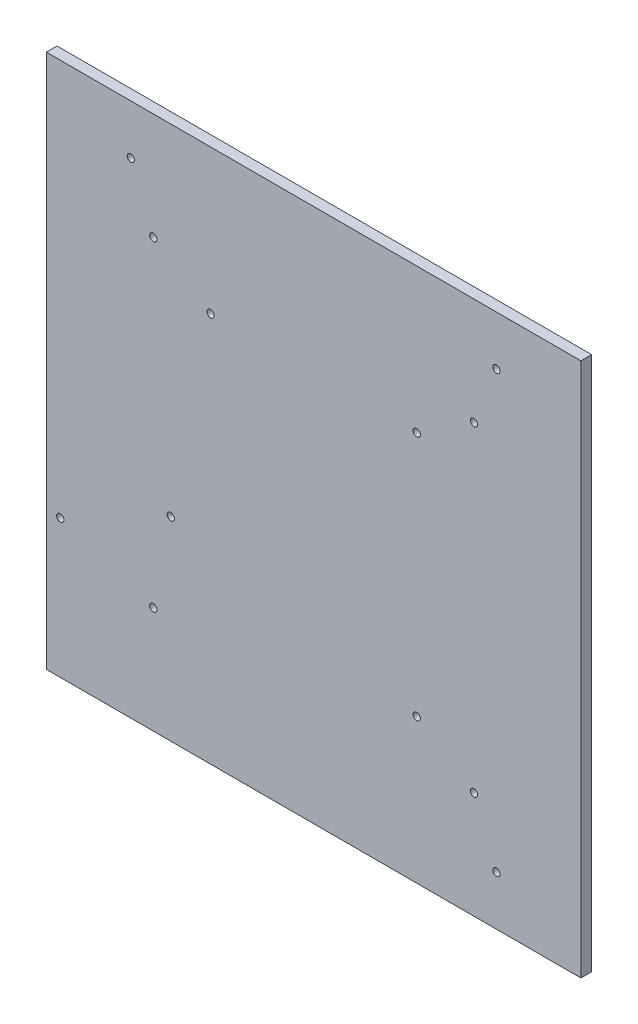
ISO-10303-21;
HEADER;
FILE_DESCRIPTION(('STEP AP214'),'2;1');
FILE_NAME('part.step','',(''),(''),'','','');
FILE_SCHEMA(('AUTOMOTIVE_DESIGN { 1 0 10303 214 1 1 1 1 }'));
ENDSEC;
DATA;
#1=APPLICATION_CONTEXT('core data for automotive mechanical design processes');
#2=APPLICATION_PROTOCOL_DEFINITION('international standard','automotive_design',2000,#1);
#3=PRODUCT_CONTEXT('',#1,'mechanical');
#4=PRODUCT('Part','Part','',(#3));
#5=PRODUCT_RELATED_PRODUCT_CATEGORY('part','',(#4));
#6=PRODUCT_DEFINITION_FORMATION('','',#4);
#7=PRODUCT_DEFINITION_CONTEXT('part definition',#1,'design');
#8=PRODUCT_DEFINITION('design','',#6,#7);
#9=PRODUCT_DEFINITION_SHAPE('','',#8);
#10=(LENGTH_UNIT() NAMED_UNIT(*) SI_UNIT(.MILLI.,.METRE.));
#11=(NAMED_UNIT(*) PLANE_ANGLE_UNIT() SI_UNIT($,.RADIAN.));
#12=(NAMED_UNIT(*) SI_UNIT($,.STERADIAN.) SOLID_ANGLE_UNIT());
#13=UNCERTAINTY_MEASURE_WITH_UNIT(LENGTH_MEASURE(1.E-05),#10,'distance_accuracy_value','');
#14=(GEOMETRIC_REPRESENTATION_CONTEXT(3) GLOBAL_UNCERTAINTY_ASSIGNED_CONTEXT((#13)) GLOBAL_UNIT_ASSIGNED_CONTEXT((#10,
#11,#12)) REPRESENTATION_CONTEXT('',''));
#15=CARTESIAN_POINT('',(0.,0.,0.));
#16=DIRECTION('',(0.,0.,1.));
#17=DIRECTION('',(1.,0.,0.));
#18=AXIS2_PLACEMENT_3D('',#15,#16,#17);
#19=CARTESIAN_POINT('',(250.,-250.,10.));
#20=DIRECTION('',(-1.,0.,0.));
#21=DIRECTION('',(0.,0.,1.));
#22=AXIS2_PLACEMENT_3D('',#19,#20,#21);
#23=PLANE('',#22);
#24=DIRECTION('',(0.,1.,0.));
#25=VECTOR('',#24,1.);
#26=CARTESIAN_POINT('',(250.,-250.,0.));
#27=LINE('',#26,#25);
#28=CARTESIAN_POINT('',(250.,-250.,0.));
#29=VERTEX_POINT('',#28);
#30=CARTESIAN_POINT('',(250.,250.,0.));
#31=VERTEX_POINT('',#30);
#32=EDGE_CURVE('E97',#29,#31,#27,.T.);
#33=ORIENTED_EDGE('',*,*,#32,.T.);
#34=DIRECTION('',(0.,0.,-1.));
#35=VECTOR('',#34,1.);
#36=CARTESIAN_POINT('',(250.,250.,10.));
#37=LINE('',#36,#35);
#38=CARTESIAN_POINT('',(250.,250.,10.));
#39=VERTEX_POINT('',#38);
#40=EDGE_CURVE('E11',#39,#31,#37,.T.);
#41=ORIENTED_EDGE('',*,*,#40,.F.);
#42=DIRECTION('',(0.,1.,0.));
#43=VECTOR('',#42,1.);
#44=CARTESIAN_POINT('',(250.,-250.,10.));
#45=LINE('',#44,#43);
#46=CARTESIAN_POINT('',(250.,-250.,10.));
#47=VERTEX_POINT('',#46);
#48=EDGE_CURVE('E85',#47,#39,#45,.T.);
#49=ORIENTED_EDGE('',*,*,#48,.F.);
#50=DIRECTION('',(0.,0.,-1.));
#51=VECTOR('',#50,1.);
#52=CARTESIAN_POINT('',(250.,-250.,10.));
#53=LINE('',#52,#51);
#54=EDGE_CURVE('E93',#47,#29,#53,.T.);
#55=ORIENTED_EDGE('',*,*,#54,.T.);
#56=EDGE_LOOP('',(#33,#41,#49,#55));
#57=FACE_BOUND('',#56,.T.);
#58=ADVANCED_FACE('F34',(#57),#23,.F.);
#59=CARTESIAN_POINT('',(-250.,250.,10.));
#60=DIRECTION('',(0.,-1.,0.));
#61=DIRECTION('',(0.,0.,-1.));
#62=AXIS2_PLACEMENT_3D('',#59,#60,#61);
#63=PLANE('',#62);
#64=DIRECTION('',(-1.,0.,0.));
#65=VECTOR('',#64,1.);
#66=CARTESIAN_POINT('',(-250.,250.,0.));
#67=LINE('',#66,#65);
#68=CARTESIAN_POINT('',(-250.,250.,0.));
#69=VERTEX_POINT('',#68);
#70=EDGE_CURVE('E89',#31,#69,#67,.T.);
#71=ORIENTED_EDGE('',*,*,#70,.T.);
#72=DIRECTION('',(0.,0.,-1.));
#73=VECTOR('',#72,1.);
#74=CARTESIAN_POINT('',(-250.,250.,10.));
#75=LINE('',#74,#73);
#76=CARTESIAN_POINT('',(-250.,250.,10.));
#77=VERTEX_POINT('',#76);
#78=EDGE_CURVE('E42',#77,#69,#75,.T.);
#79=ORIENTED_EDGE('',*,*,#78,.F.);
#80=DIRECTION('',(-1.,0.,0.));
#81=VECTOR('',#80,1.);
#82=CARTESIAN_POINT('',(-250.,250.,10.));
#83=LINE('',#82,#81);
#84=EDGE_CURVE('E80',#39,#77,#83,.T.);
#85=ORIENTED_EDGE('',*,*,#84,.F.);
#86=ORIENTED_EDGE('',*,*,#40,.T.);
#87=EDGE_LOOP('',(#71,#79,#85,#86));
#88=FACE_BOUND('',#87,.T.);
#89=ADVANCED_FACE('F88',(#88),#63,.F.);
#90=CARTESIAN_POINT('',(-250.,-250.,10.));
#91=DIRECTION('',(1.,0.,0.));
#92=DIRECTION('',(0.,0.,-1.));
#93=AXIS2_PLACEMENT_3D('',#90,#91,#92);
#94=PLANE('',#93);
#95=DIRECTION('',(0.,-1.,0.));
#96=VECTOR('',#95,1.);
#97=CARTESIAN_POINT('',(-250.,-250.,0.));
#98=LINE('',#97,#96);
#99=CARTESIAN_POINT('',(-250.,-250.,0.));
#100=VERTEX_POINT('',#99);
#101=EDGE_CURVE('E67',#69,#100,#98,.T.);
#102=ORIENTED_EDGE('',*,*,#101,.T.);
#103=DIRECTION('',(0.,0.,-1.));
#104=VECTOR('',#103,1.);
#105=CARTESIAN_POINT('',(-250.,-250.,10.));
#106=LINE('',#105,#104);
#107=CARTESIAN_POINT('',(-250.,-250.,10.));
#108=VERTEX_POINT('',#107);
#109=EDGE_CURVE('E90',#108,#100,#106,.T.);
#110=ORIENTED_EDGE('',*,*,#109,.F.);
#111=DIRECTION('',(0.,-1.,0.));
#112=VECTOR('',#111,1.);
#113=CARTESIAN_POINT('',(-250.,-250.,10.));
#114=LINE('',#113,#112);
#115=EDGE_CURVE('E83',#77,#108,#114,.T.);
#116=ORIENTED_EDGE('',*,*,#115,.F.);
#117=ORIENTED_EDGE('',*,*,#78,.T.);
#118=EDGE_LOOP('',(#102,#110,#116,#117));
#119=FACE_BOUND('',#118,.T.);
#120=ADVANCED_FACE('F91',(#119),#94,.F.);
#121=CARTESIAN_POINT('',(-250.,-250.,10.));
#122=DIRECTION('',(0.,1.,0.));
#123=DIRECTION('',(0.,0.,1.));
#124=AXIS2_PLACEMENT_3D('',#121,#122,#123);
#125=PLANE('',#124);
#126=DIRECTION('',(1.,0.,0.));
#127=VECTOR('',#126,1.);
#128=CARTESIAN_POINT('',(-250.,-250.,0.));
#129=LINE('',#128,#127);
#130=EDGE_CURVE('E73',#100,#29,#129,.T.);
#131=ORIENTED_EDGE('',*,*,#130,.T.);
#132=ORIENTED_EDGE('',*,*,#54,.F.);
#133=DIRECTION('',(1.,0.,0.));
#134=VECTOR('',#133,1.);
#135=CARTESIAN_POINT('',(-250.,-250.,10.));
#136=LINE('',#135,#134);
#137=EDGE_CURVE('E50',#108,#47,#136,.T.);
#138=ORIENTED_EDGE('',*,*,#137,.F.);
#139=ORIENTED_EDGE('',*,*,#109,.T.);
#140=EDGE_LOOP('',(#131,#132,#138,#139));
#141=FACE_BOUND('',#140,.T.);
#142=ADVANCED_FACE('F105',(#141),#125,.F.);
#143=CARTESIAN_POINT('',(0.,0.,10.));
#144=DIRECTION('',(0.,0.,-1.));
#145=DIRECTION('',(-1.,0.,0.));
#146=AXIS2_PLACEMENT_3D('',#143,#144,#145);
#147=PLANE('',#146);
#148=CARTESIAN_POINT('',(-96.4181414529803,114.906666467847,10.));
#149=DIRECTION('',(0.,0.,1.));
#150=DIRECTION('',(1.,0.,0.));
#151=AXIS2_PLACEMENT_3D('',#148,#149,#150);
#152=CIRCLE('',#151,3.39999999999999);
#153=CARTESIAN_POINT('',(-93.0181414529803,114.906666467847,10.));
#154=VERTEX_POINT('',#153);
#155=EDGE_CURVE('E179',#154,#154,#152,.T.);
#156=ORIENTED_EDGE('',*,*,#155,.F.);
#157=EDGE_LOOP('',(#156));
#158=FACE_BOUND('',#157,.T.);
#159=CARTESIAN_POINT('',(96.4181414529802,114.906666467847,10.));
#160=DIRECTION('',(0.,0.,1.));
#161=DIRECTION('',(1.,0.,0.));
#162=AXIS2_PLACEMENT_3D('',#159,#160,#161);
#163=CIRCLE('',#162,3.39999999999999);
#164=CARTESIAN_POINT('',(99.8181414529802,114.906666467847,10.));
#165=VERTEX_POINT('',#164);
#166=EDGE_CURVE('E173',#165,#165,#163,.T.);
#167=ORIENTED_EDGE('',*,*,#166,.F.);
#168=EDGE_LOOP('',(#167));
#169=FACE_BOUND('',#168,.T.);
#170=CARTESIAN_POINT('',(96.4181414529812,-114.906666467847,10.));
#171=DIRECTION('',(0.,0.,1.));
#172=DIRECTION('',(1.,0.,0.));
#173=AXIS2_PLACEMENT_3D('',#170,#171,#172);
#174=CIRCLE('',#173,3.39999999999999);
#175=CARTESIAN_POINT('',(99.8181414529812,-114.906666467847,10.));
#176=VERTEX_POINT('',#175);
#177=EDGE_CURVE('E167',#176,#176,#174,.T.);
#178=ORIENTED_EDGE('',*,*,#177,.F.);
#179=EDGE_LOOP('',(#178));
#180=FACE_BOUND('',#179,.T.);
#181=CARTESIAN_POINT('',(-133.650978628255,-68.0985749609317,10.));
#182=DIRECTION('',(0.,0.,1.));
#183=DIRECTION('',(1.,0.,0.));
#184=AXIS2_PLACEMENT_3D('',#181,#182,#183);
#185=CIRCLE('',#184,3.39999999999999);
#186=CARTESIAN_POINT('',(-130.250978628255,-68.0985749609317,10.));
#187=VERTEX_POINT('',#186);
#188=EDGE_CURVE('E161',#187,#187,#185,.T.);
#189=ORIENTED_EDGE('',*,*,#188,.F.);
#190=EDGE_LOOP('',(#189));
#191=FACE_BOUND('',#190,.T.);
#192=CARTESIAN_POINT('',(-170.981504176618,203.767821869649,10.));
#193=DIRECTION('',(0.,0.,1.));
#194=DIRECTION('',(1.,0.,0.));
#195=AXIS2_PLACEMENT_3D('',#192,#193,#194);
#196=CIRCLE('',#195,3.39999999999999);
#197=CARTESIAN_POINT('',(-167.581504176618,203.767821869649,10.));
#198=VERTEX_POINT('',#197);
#199=EDGE_CURVE('E155',#198,#198,#196,.T.);
#200=ORIENTED_EDGE('',*,*,#199,.F.);
#201=EDGE_LOOP('',(#200));
#202=FACE_BOUND('',#201,.T.);
#203=CARTESIAN_POINT('',(170.981504176618,203.767821869649,10.));
#204=DIRECTION('',(0.,0.,1.));
#205=DIRECTION('',(1.,0.,0.));
#206=AXIS2_PLACEMENT_3D('',#203,#204,#205);
#207=CIRCLE('',#206,3.39999999999999);
#208=CARTESIAN_POINT('',(174.381504176618,203.767821869649,10.));
#209=VERTEX_POINT('',#208);
#210=EDGE_CURVE('E149',#209,#209,#207,.T.);
#211=ORIENTED_EDGE('',*,*,#210,.F.);
#212=EDGE_LOOP('',(#211));
#213=FACE_BOUND('',#212,.T.);
#214=CARTESIAN_POINT('',(-237.007735434106,-120.761472930719,10.));
#215=DIRECTION('',(0.,0.,1.));
#216=DIRECTION('',(1.,0.,0.));
#217=AXIS2_PLACEMENT_3D('',#214,#215,#216);
#218=CIRCLE('',#217,3.39999999999999);
#219=CARTESIAN_POINT('',(-233.607735434106,-120.761472930719,10.));
#220=VERTEX_POINT('',#219);
#221=EDGE_CURVE('E143',#220,#220,#218,.T.);
#222=ORIENTED_EDGE('',*,*,#221,.F.);
#223=EDGE_LOOP('',(#222));
#224=FACE_BOUND('',#223,.T.);
#225=CARTESIAN_POINT('',(170.98150417662,-203.767821869648,10.));
#226=DIRECTION('',(0.,0.,1.));
#227=DIRECTION('',(1.,0.,0.));
#228=AXIS2_PLACEMENT_3D('',#225,#226,#227);
#229=CIRCLE('',#228,3.39999999999999);
#230=CARTESIAN_POINT('',(174.38150417662,-203.767821869648,10.));
#231=VERTEX_POINT('',#230);
#232=EDGE_CURVE('E137',#231,#231,#229,.T.);
#233=ORIENTED_EDGE('',*,*,#232,.F.);
#234=EDGE_LOOP('',(#233));
#235=FACE_BOUND('',#234,.T.);
#236=CARTESIAN_POINT('',(-150.,150.,10.));
#237=DIRECTION('',(0.,0.,1.));
#238=DIRECTION('',(1.,0.,0.));
#239=AXIS2_PLACEMENT_3D('',#236,#237,#238);
#240=CIRCLE('',#239,3.39999999999999);
#241=CARTESIAN_POINT('',(-146.6,150.,10.));
#242=VERTEX_POINT('',#241);
#243=EDGE_CURVE('E131',#242,#242,#240,.T.);
#244=ORIENTED_EDGE('',*,*,#243,.F.);
#245=EDGE_LOOP('',(#244));
#246=FACE_BOUND('',#245,.T.);
#247=CARTESIAN_POINT('',(150.,150.,10.));
#248=DIRECTION('',(0.,0.,1.));
#249=DIRECTION('',(1.,0.,0.));
#250=AXIS2_PLACEMENT_3D('',#247,#248,#249);
#251=CIRCLE('',#250,3.39999999999999);
#252=CARTESIAN_POINT('',(153.4,150.,10.));
#253=VERTEX_POINT('',#252);
#254=EDGE_CURVE('E125',#253,#253,#251,.T.);
#255=ORIENTED_EDGE('',*,*,#254,.F.);
#256=EDGE_LOOP('',(#255));
#257=FACE_BOUND('',#256,.T.);
#258=CARTESIAN_POINT('',(-150.,-150.,10.));
#259=DIRECTION('',(0.,0.,1.));
#260=DIRECTION('',(1.,0.,0.));
#261=AXIS2_PLACEMENT_3D('',#258,#259,#260);
#262=CIRCLE('',#261,3.39999999999999);
#263=CARTESIAN_POINT('',(-146.6,-150.,10.));
#264=VERTEX_POINT('',#263);
#265=EDGE_CURVE('E119',#264,#264,#262,.T.);
#266=ORIENTED_EDGE('',*,*,#265,.F.);
#267=EDGE_LOOP('',(#266));
#268=FACE_BOUND('',#267,.T.);
#269=CARTESIAN_POINT('',(150.,-150.,10.));
#270=DIRECTION('',(0.,0.,1.));
#271=DIRECTION('',(1.,0.,0.));
#272=AXIS2_PLACEMENT_3D('',#269,#270,#271);
#273=CIRCLE('',#272,3.39999999999999);
#274=CARTESIAN_POINT('',(153.4,-150.,10.));
#275=VERTEX_POINT('',#274);
#276=EDGE_CURVE('E113',#275,#275,#273,.T.);
#277=ORIENTED_EDGE('',*,*,#276,.F.);
#278=EDGE_LOOP('',(#277));
#279=FACE_BOUND('',#278,.T.);
#280=ORIENTED_EDGE('',*,*,#48,.T.);
#281=ORIENTED_EDGE('',*,*,#84,.T.);
#282=ORIENTED_EDGE('',*,*,#115,.T.);
#283=ORIENTED_EDGE('',*,*,#137,.T.);
#284=EDGE_LOOP('',(#280,#281,#282,#283));
#285=FACE_BOUND('',#284,.T.);
#286=ADVANCED_FACE('F81',(#158,#169,#180,#191,#202,#213,#224,#235,#246,#257,#268,#279,#285),
#147,.F.);
#287=CARTESIAN_POINT('',(0.,0.,0.));
#288=DIRECTION('',(0.,0.,-1.));
#289=DIRECTION('',(-1.,0.,0.));
#290=AXIS2_PLACEMENT_3D('',#287,#288,#289);
#291=PLANE('',#290);
#292=CARTESIAN_POINT('',(-96.4181414529803,114.906666467847,0.));
#293=DIRECTION('',(0.,0.,1.));
#294=DIRECTION('',(1.,0.,0.));
#295=AXIS2_PLACEMENT_3D('',#292,#293,#294);
#296=CIRCLE('',#295,3.4);
#297=CARTESIAN_POINT('',(-93.0181414529803,114.906666467847,0.));
#298=VERTEX_POINT('',#297);
#299=EDGE_CURVE('E176',#298,#298,#296,.T.);
#300=ORIENTED_EDGE('',*,*,#299,.T.);
#301=EDGE_LOOP('',(#300));
#302=FACE_BOUND('',#301,.T.);
#303=CARTESIAN_POINT('',(96.4181414529802,114.906666467847,0.));
#304=DIRECTION('',(0.,0.,1.));
#305=DIRECTION('',(1.,0.,0.));
#306=AXIS2_PLACEMENT_3D('',#303,#304,#305);
#307=CIRCLE('',#306,3.4);
#308=CARTESIAN_POINT('',(99.8181414529802,114.906666467847,0.));
#309=VERTEX_POINT('',#308);
#310=EDGE_CURVE('E170',#309,#309,#307,.T.);
#311=ORIENTED_EDGE('',*,*,#310,.T.);
#312=EDGE_LOOP('',(#311));
#313=FACE_BOUND('',#312,.T.);
#314=CARTESIAN_POINT('',(96.4181414529812,-114.906666467847,0.));
#315=DIRECTION('',(0.,0.,1.));
#316=DIRECTION('',(1.,0.,0.));
#317=AXIS2_PLACEMENT_3D('',#314,#315,#316);
#318=CIRCLE('',#317,3.4);
#319=CARTESIAN_POINT('',(99.8181414529812,-114.906666467847,0.));
#320=VERTEX_POINT('',#319);
#321=EDGE_CURVE('E164',#320,#320,#318,.T.);
#322=ORIENTED_EDGE('',*,*,#321,.T.);
#323=EDGE_LOOP('',(#322));
#324=FACE_BOUND('',#323,.T.);
#325=CARTESIAN_POINT('',(-133.650978628255,-68.0985749609317,0.));
#326=DIRECTION('',(0.,0.,1.));
#327=DIRECTION('',(1.,0.,0.));
#328=AXIS2_PLACEMENT_3D('',#325,#326,#327);
#329=CIRCLE('',#328,3.39999999999999);
#330=CARTESIAN_POINT('',(-130.250978628255,-68.0985749609317,0.));
#331=VERTEX_POINT('',#330);
#332=EDGE_CURVE('E158',#331,#331,#329,.T.);
#333=ORIENTED_EDGE('',*,*,#332,.T.);
#334=EDGE_LOOP('',(#333));
#335=FACE_BOUND('',#334,.T.);
#336=CARTESIAN_POINT('',(-170.981504176618,203.767821869649,0.));
#337=DIRECTION('',(0.,0.,1.));
#338=DIRECTION('',(1.,0.,0.));
#339=AXIS2_PLACEMENT_3D('',#336,#337,#338);
#340=CIRCLE('',#339,3.39999999999999);
#341=CARTESIAN_POINT('',(-167.581504176618,203.767821869649,0.));
#342=VERTEX_POINT('',#341);
#343=EDGE_CURVE('E152',#342,#342,#340,.T.);
#344=ORIENTED_EDGE('',*,*,#343,.T.);
#345=EDGE_LOOP('',(#344));
#346=FACE_BOUND('',#345,.T.);
#347=CARTESIAN_POINT('',(170.981504176618,203.767821869649,0.));
#348=DIRECTION('',(0.,0.,1.));
#349=DIRECTION('',(1.,0.,0.));
#350=AXIS2_PLACEMENT_3D('',#347,#348,#349);
#351=CIRCLE('',#350,3.39999999999999);
#352=CARTESIAN_POINT('',(174.381504176618,203.767821869649,0.));
#353=VERTEX_POINT('',#352);
#354=EDGE_CURVE('E146',#353,#353,#351,.T.);
#355=ORIENTED_EDGE('',*,*,#354,.T.);
#356=EDGE_LOOP('',(#355));
#357=FACE_BOUND('',#356,.T.);
#358=CARTESIAN_POINT('',(-237.007735434106,-120.761472930719,0.));
#359=DIRECTION('',(0.,0.,1.));
#360=DIRECTION('',(1.,0.,0.));
#361=AXIS2_PLACEMENT_3D('',#358,#359,#360);
#362=CIRCLE('',#361,3.39999999999999);
#363=CARTESIAN_POINT('',(-233.607735434106,-120.761472930719,0.));
#364=VERTEX_POINT('',#363);
#365=EDGE_CURVE('E140',#364,#364,#362,.T.);
#366=ORIENTED_EDGE('',*,*,#365,.T.);
#367=EDGE_LOOP('',(#366));
#368=FACE_BOUND('',#367,.T.);
#369=CARTESIAN_POINT('',(170.98150417662,-203.767821869648,0.));
#370=DIRECTION('',(0.,0.,1.));
#371=DIRECTION('',(1.,0.,0.));
#372=AXIS2_PLACEMENT_3D('',#369,#370,#371);
#373=CIRCLE('',#372,3.39999999999999);
#374=CARTESIAN_POINT('',(174.38150417662,-203.767821869648,0.));
#375=VERTEX_POINT('',#374);
#376=EDGE_CURVE('E134',#375,#375,#373,.T.);
#377=ORIENTED_EDGE('',*,*,#376,.T.);
#378=EDGE_LOOP('',(#377));
#379=FACE_BOUND('',#378,.T.);
#380=CARTESIAN_POINT('',(-150.,150.,0.));
#381=DIRECTION('',(0.,0.,1.));
#382=DIRECTION('',(1.,0.,0.));
#383=AXIS2_PLACEMENT_3D('',#380,#381,#382);
#384=CIRCLE('',#383,3.39999999999999);
#385=CARTESIAN_POINT('',(-146.6,150.,0.));
#386=VERTEX_POINT('',#385);
#387=EDGE_CURVE('E128',#386,#386,#384,.T.);
#388=ORIENTED_EDGE('',*,*,#387,.T.);
#389=EDGE_LOOP('',(#388));
#390=FACE_BOUND('',#389,.T.);
#391=CARTESIAN_POINT('',(150.,150.,0.));
#392=DIRECTION('',(0.,0.,1.));
#393=DIRECTION('',(1.,0.,0.));
#394=AXIS2_PLACEMENT_3D('',#391,#392,#393);
#395=CIRCLE('',#394,3.39999999999999);
#396=CARTESIAN_POINT('',(153.4,150.,0.));
#397=VERTEX_POINT('',#396);
#398=EDGE_CURVE('E122',#397,#397,#395,.T.);
#399=ORIENTED_EDGE('',*,*,#398,.T.);
#400=EDGE_LOOP('',(#399));
#401=FACE_BOUND('',#400,.T.);
#402=CARTESIAN_POINT('',(-150.,-150.,0.));
#403=DIRECTION('',(0.,0.,1.));
#404=DIRECTION('',(1.,0.,0.));
#405=AXIS2_PLACEMENT_3D('',#402,#403,#404);
#406=CIRCLE('',#405,3.39999999999999);
#407=CARTESIAN_POINT('',(-146.6,-150.,0.));
#408=VERTEX_POINT('',#407);
#409=EDGE_CURVE('E116',#408,#408,#406,.T.);
#410=ORIENTED_EDGE('',*,*,#409,.T.);
#411=EDGE_LOOP('',(#410));
#412=FACE_BOUND('',#411,.T.);
#413=CARTESIAN_POINT('',(150.,-150.,0.));
#414=DIRECTION('',(0.,0.,1.));
#415=DIRECTION('',(1.,0.,0.));
#416=AXIS2_PLACEMENT_3D('',#413,#414,#415);
#417=CIRCLE('',#416,3.39999999999999);
#418=CARTESIAN_POINT('',(153.4,-150.,0.));
#419=VERTEX_POINT('',#418);
#420=EDGE_CURVE('E100',#419,#419,#417,.T.);
#421=ORIENTED_EDGE('',*,*,#420,.T.);
#422=EDGE_LOOP('',(#421));
#423=FACE_BOUND('',#422,.T.);
#424=ORIENTED_EDGE('',*,*,#32,.F.);
#425=ORIENTED_EDGE('',*,*,#130,.F.);
#426=ORIENTED_EDGE('',*,*,#101,.F.);
#427=ORIENTED_EDGE('',*,*,#70,.F.);
#428=EDGE_LOOP('',(#424,#425,#426,#427));
#429=FACE_BOUND('',#428,.T.);
#430=ADVANCED_FACE('F108',(#302,#313,#324,#335,#346,#357,#368,#379,#390,#401,#412,#423,#429),
#291,.T.);
#431=CARTESIAN_POINT('',(150.,-150.,10.));
#432=DIRECTION('',(0.,0.,1.));
#433=DIRECTION('',(1.,0.,0.));
#434=AXIS2_PLACEMENT_3D('',#431,#432,#433);
#435=CYLINDRICAL_SURFACE('',#434,3.39999999999999);
#436=ORIENTED_EDGE('',*,*,#420,.F.);
#437=EDGE_LOOP('',(#436));
#438=FACE_BOUND('',#437,.T.);
#439=ORIENTED_EDGE('',*,*,#276,.T.);
#440=EDGE_LOOP('',(#439));
#441=FACE_BOUND('',#440,.T.);
#442=ADVANCED_FACE('F210',(#438,#441),#435,.F.);
#443=CARTESIAN_POINT('',(-150.,-150.,10.));
#444=DIRECTION('',(0.,0.,1.));
#445=DIRECTION('',(1.,0.,0.));
#446=AXIS2_PLACEMENT_3D('',#443,#444,#445);
#447=CYLINDRICAL_SURFACE('',#446,3.39999999999999);
#448=ORIENTED_EDGE('',*,*,#409,.F.);
#449=EDGE_LOOP('',(#448));
#450=FACE_BOUND('',#449,.T.);
#451=ORIENTED_EDGE('',*,*,#265,.T.);
#452=EDGE_LOOP('',(#451));
#453=FACE_BOUND('',#452,.T.);
#454=ADVANCED_FACE('F212',(#450,#453),#447,.F.);
#455=CARTESIAN_POINT('',(150.,150.,10.));
#456=DIRECTION('',(0.,0.,1.));
#457=DIRECTION('',(1.,0.,0.));
#458=AXIS2_PLACEMENT_3D('',#455,#456,#457);
#459=CYLINDRICAL_SURFACE('',#458,3.39999999999999);
#460=ORIENTED_EDGE('',*,*,#398,.F.);
#461=EDGE_LOOP('',(#460));
#462=FACE_BOUND('',#461,.T.);
#463=ORIENTED_EDGE('',*,*,#254,.T.);
#464=EDGE_LOOP('',(#463));
#465=FACE_BOUND('',#464,.T.);
#466=ADVANCED_FACE('F219',(#462,#465),#459,.F.);
#467=CARTESIAN_POINT('',(-150.,150.,10.));
#468=DIRECTION('',(0.,0.,1.));
#469=DIRECTION('',(1.,0.,0.));
#470=AXIS2_PLACEMENT_3D('',#467,#468,#469);
#471=CYLINDRICAL_SURFACE('',#470,3.39999999999999);
#472=ORIENTED_EDGE('',*,*,#387,.F.);
#473=EDGE_LOOP('',(#472));
#474=FACE_BOUND('',#473,.T.);
#475=ORIENTED_EDGE('',*,*,#243,.T.);
#476=EDGE_LOOP('',(#475));
#477=FACE_BOUND('',#476,.T.);
#478=ADVANCED_FACE('F262',(#474,#477),#471,.F.);
#479=CARTESIAN_POINT('',(170.98150417662,-203.767821869648,10.));
#480=DIRECTION('',(0.,0.,1.));
#481=DIRECTION('',(1.,0.,0.));
#482=AXIS2_PLACEMENT_3D('',#479,#480,#481);
#483=CYLINDRICAL_SURFACE('',#482,3.39999999999999);
#484=ORIENTED_EDGE('',*,*,#376,.F.);
#485=EDGE_LOOP('',(#484));
#486=FACE_BOUND('',#485,.T.);
#487=ORIENTED_EDGE('',*,*,#232,.T.);
#488=EDGE_LOOP('',(#487));
#489=FACE_BOUND('',#488,.T.);
#490=ADVANCED_FACE('F255',(#486,#489),#483,.F.);
#491=CARTESIAN_POINT('',(-237.007735434106,-120.761472930719,10.));
#492=DIRECTION('',(0.,0.,1.));
#493=DIRECTION('',(1.,0.,0.));
#494=AXIS2_PLACEMENT_3D('',#491,#492,#493);
#495=CYLINDRICAL_SURFACE('',#494,3.39999999999999);
#496=ORIENTED_EDGE('',*,*,#365,.F.);
#497=EDGE_LOOP('',(#496));
#498=FACE_BOUND('',#497,.T.);
#499=ORIENTED_EDGE('',*,*,#221,.T.);
#500=EDGE_LOOP('',(#499));
#501=FACE_BOUND('',#500,.T.);
#502=ADVANCED_FACE('F261',(#498,#501),#495,.F.);
#503=CARTESIAN_POINT('',(170.981504176618,203.767821869649,10.));
#504=DIRECTION('',(0.,0.,1.));
#505=DIRECTION('',(1.,0.,0.));
#506=AXIS2_PLACEMENT_3D('',#503,#504,#505);
#507=CYLINDRICAL_SURFACE('',#506,3.39999999999999);
#508=ORIENTED_EDGE('',*,*,#354,.F.);
#509=EDGE_LOOP('',(#508));
#510=FACE_BOUND('',#509,.T.);
#511=ORIENTED_EDGE('',*,*,#210,.T.);
#512=EDGE_LOOP('',(#511));
#513=FACE_BOUND('',#512,.T.);
#514=ADVANCED_FACE('F275',(#510,#513),#507,.F.);
#515=CARTESIAN_POINT('',(-170.981504176618,203.767821869649,10.));
#516=DIRECTION('',(0.,0.,1.));
#517=DIRECTION('',(1.,0.,0.));
#518=AXIS2_PLACEMENT_3D('',#515,#516,#517);
#519=CYLINDRICAL_SURFACE('',#518,3.39999999999999);
#520=ORIENTED_EDGE('',*,*,#343,.F.);
#521=EDGE_LOOP('',(#520));
#522=FACE_BOUND('',#521,.T.);
#523=ORIENTED_EDGE('',*,*,#199,.T.);
#524=EDGE_LOOP('',(#523));
#525=FACE_BOUND('',#524,.T.);
#526=ADVANCED_FACE('F286',(#522,#525),#519,.F.);
#527=CARTESIAN_POINT('',(-133.650978628255,-68.0985749609317,10.));
#528=DIRECTION('',(0.,0.,1.));
#529=DIRECTION('',(1.,0.,0.));
#530=AXIS2_PLACEMENT_3D('',#527,#528,#529);
#531=CYLINDRICAL_SURFACE('',#530,3.39999999999999);
#532=ORIENTED_EDGE('',*,*,#332,.F.);
#533=EDGE_LOOP('',(#532));
#534=FACE_BOUND('',#533,.T.);
#535=ORIENTED_EDGE('',*,*,#188,.T.);
#536=EDGE_LOOP('',(#535));
#537=FACE_BOUND('',#536,.T.);
#538=ADVANCED_FACE('F297',(#534,#537),#531,.F.);
#539=CARTESIAN_POINT('',(96.4181414529812,-114.906666467847,10.));
#540=DIRECTION('',(0.,0.,1.));
#541=DIRECTION('',(1.,0.,0.));
#542=AXIS2_PLACEMENT_3D('',#539,#540,#541);
#543=CYLINDRICAL_SURFACE('',#542,3.39999999999999);
#544=ORIENTED_EDGE('',*,*,#321,.F.);
#545=EDGE_LOOP('',(#544));
#546=FACE_BOUND('',#545,.T.);
#547=ORIENTED_EDGE('',*,*,#177,.T.);
#548=EDGE_LOOP('',(#547));
#549=FACE_BOUND('',#548,.T.);
#550=ADVANCED_FACE('F308',(#546,#549),#543,.F.);
#551=CARTESIAN_POINT('',(96.4181414529802,114.906666467847,10.));
#552=DIRECTION('',(0.,0.,1.));
#553=DIRECTION('',(1.,0.,0.));
#554=AXIS2_PLACEMENT_3D('',#551,#552,#553);
#555=CYLINDRICAL_SURFACE('',#554,3.39999999999999);
#556=ORIENTED_EDGE('',*,*,#310,.F.);
#557=EDGE_LOOP('',(#556));
#558=FACE_BOUND('',#557,.T.);
#559=ORIENTED_EDGE('',*,*,#166,.T.);
#560=EDGE_LOOP('',(#559));
#561=FACE_BOUND('',#560,.T.);
#562=ADVANCED_FACE('F319',(#558,#561),#555,.F.);
#563=CARTESIAN_POINT('',(-96.4181414529803,114.906666467847,10.));
#564=DIRECTION('',(0.,0.,1.));
#565=DIRECTION('',(1.,0.,0.));
#566=AXIS2_PLACEMENT_3D('',#563,#564,#565);
#567=CYLINDRICAL_SURFACE('',#566,3.39999999999999);
#568=ORIENTED_EDGE('',*,*,#299,.F.);
#569=EDGE_LOOP('',(#568));
#570=FACE_BOUND('',#569,.T.);
#571=ORIENTED_EDGE('',*,*,#155,.T.);
#572=EDGE_LOOP('',(#571));
#573=FACE_BOUND('',#572,.T.);
#574=ADVANCED_FACE('F183',(#570,#573),#567,.F.);
#575=CLOSED_SHELL('',(#58,#89,#120,#142,#286,#430,#442,#454,#466,#478,#490,#502,#514,#526,#538,
#550,#562,#574));
#576=MANIFOLD_SOLID_BREP('B2',#575);
#577=ADVANCED_BREP_SHAPE_REPRESENTATION('',(#18,#576),#14);
#578=SHAPE_DEFINITION_REPRESENTATION(#9,#577);
ENDSEC;
END-ISO-10303-21;
